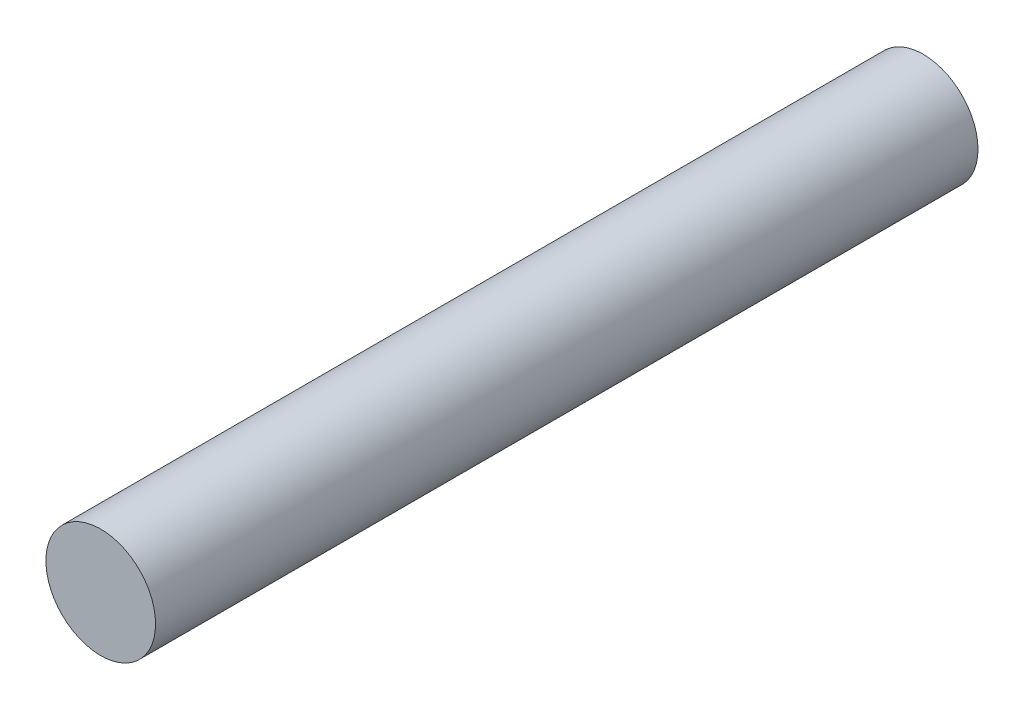
ISO-10303-21;
HEADER;
FILE_DESCRIPTION(('STEP AP214'),'2;1');
FILE_NAME('part.step','',(''),(''),'','','');
FILE_SCHEMA(('AUTOMOTIVE_DESIGN { 1 0 10303 214 1 1 1 1 }'));
ENDSEC;
DATA;
#1=APPLICATION_CONTEXT('core data for automotive mechanical design processes');
#2=APPLICATION_PROTOCOL_DEFINITION('international standard','automotive_design',2000,#1);
#3=PRODUCT_CONTEXT('',#1,'mechanical');
#4=PRODUCT('Part','Part','',(#3));
#5=PRODUCT_RELATED_PRODUCT_CATEGORY('part','',(#4));
#6=PRODUCT_DEFINITION_FORMATION('','',#4);
#7=PRODUCT_DEFINITION_CONTEXT('part definition',#1,'design');
#8=PRODUCT_DEFINITION('design','',#6,#7);
#9=PRODUCT_DEFINITION_SHAPE('','',#8);
#10=(LENGTH_UNIT() NAMED_UNIT(*) SI_UNIT(.MILLI.,.METRE.));
#11=(NAMED_UNIT(*) PLANE_ANGLE_UNIT() SI_UNIT($,.RADIAN.));
#12=(NAMED_UNIT(*) SI_UNIT($,.STERADIAN.) SOLID_ANGLE_UNIT());
#13=UNCERTAINTY_MEASURE_WITH_UNIT(LENGTH_MEASURE(1.E-05),#10,'distance_accuracy_value','');
#14=(GEOMETRIC_REPRESENTATION_CONTEXT(3) GLOBAL_UNCERTAINTY_ASSIGNED_CONTEXT((#13)) GLOBAL_UNIT_ASSIGNED_CONTEXT((#10,
#11,#12)) REPRESENTATION_CONTEXT('',''));
#15=CARTESIAN_POINT('',(0.,0.,0.));
#16=DIRECTION('',(0.,0.,1.));
#17=DIRECTION('',(1.,0.,0.));
#18=AXIS2_PLACEMENT_3D('',#15,#16,#17);
#19=CARTESIAN_POINT('',(0.,0.,381.));
#20=DIRECTION('',(0.,0.,-1.));
#21=DIRECTION('',(-1.,0.,0.));
#22=AXIS2_PLACEMENT_3D('',#19,#20,#21);
#23=CYLINDRICAL_SURFACE('',#22,25.4);
#24=CARTESIAN_POINT('',(0.,0.,381.));
#25=DIRECTION('',(0.,0.,1.));
#26=DIRECTION('',(1.,0.,0.));
#27=AXIS2_PLACEMENT_3D('',#24,#25,#26);
#28=CIRCLE('',#27,25.4);
#29=CARTESIAN_POINT('',(25.4,0.,381.));
#30=VERTEX_POINT('',#29);
#31=EDGE_CURVE('E10',#30,#30,#28,.T.);
#32=ORIENTED_EDGE('',*,*,#31,.F.);
#33=EDGE_LOOP('',(#32));
#34=FACE_BOUND('',#33,.T.);
#35=CARTESIAN_POINT('',(0.,0.,0.));
#36=DIRECTION('',(0.,0.,1.));
#37=DIRECTION('',(1.,0.,0.));
#38=AXIS2_PLACEMENT_3D('',#35,#36,#37);
#39=CIRCLE('',#38,25.4);
#40=CARTESIAN_POINT('',(25.4,0.,0.));
#41=VERTEX_POINT('',#40);
#42=EDGE_CURVE('E40',#41,#41,#39,.T.);
#43=ORIENTED_EDGE('',*,*,#42,.T.);
#44=EDGE_LOOP('',(#43));
#45=FACE_BOUND('',#44,.T.);
#46=ADVANCED_FACE('F37',(#34,#45),#23,.T.);
#47=CARTESIAN_POINT('',(0.,0.,381.));
#48=DIRECTION('',(0.,0.,1.));
#49=DIRECTION('',(1.,0.,0.));
#50=AXIS2_PLACEMENT_3D('',#47,#48,#49);
#51=PLANE('',#50);
#52=ORIENTED_EDGE('',*,*,#31,.T.);
#53=EDGE_LOOP('',(#52));
#54=FACE_BOUND('',#53,.T.);
#55=ADVANCED_FACE('F54',(#54),#51,.T.);
#56=CARTESIAN_POINT('',(0.,0.,0.));
#57=DIRECTION('',(0.,0.,1.));
#58=DIRECTION('',(1.,0.,0.));
#59=AXIS2_PLACEMENT_3D('',#56,#57,#58);
#60=PLANE('',#59);
#61=ORIENTED_EDGE('',*,*,#42,.F.);
#62=EDGE_LOOP('',(#61));
#63=FACE_BOUND('',#62,.T.);
#64=ADVANCED_FACE('F52',(#63),#60,.F.);
#65=CLOSED_SHELL('',(#46,#55,#64));
#66=MANIFOLD_SOLID_BREP('B2',#65);
#67=ADVANCED_BREP_SHAPE_REPRESENTATION('',(#18,#66),#14);
#68=SHAPE_DEFINITION_REPRESENTATION(#9,#67);
ENDSEC;
END-ISO-10303-21;
